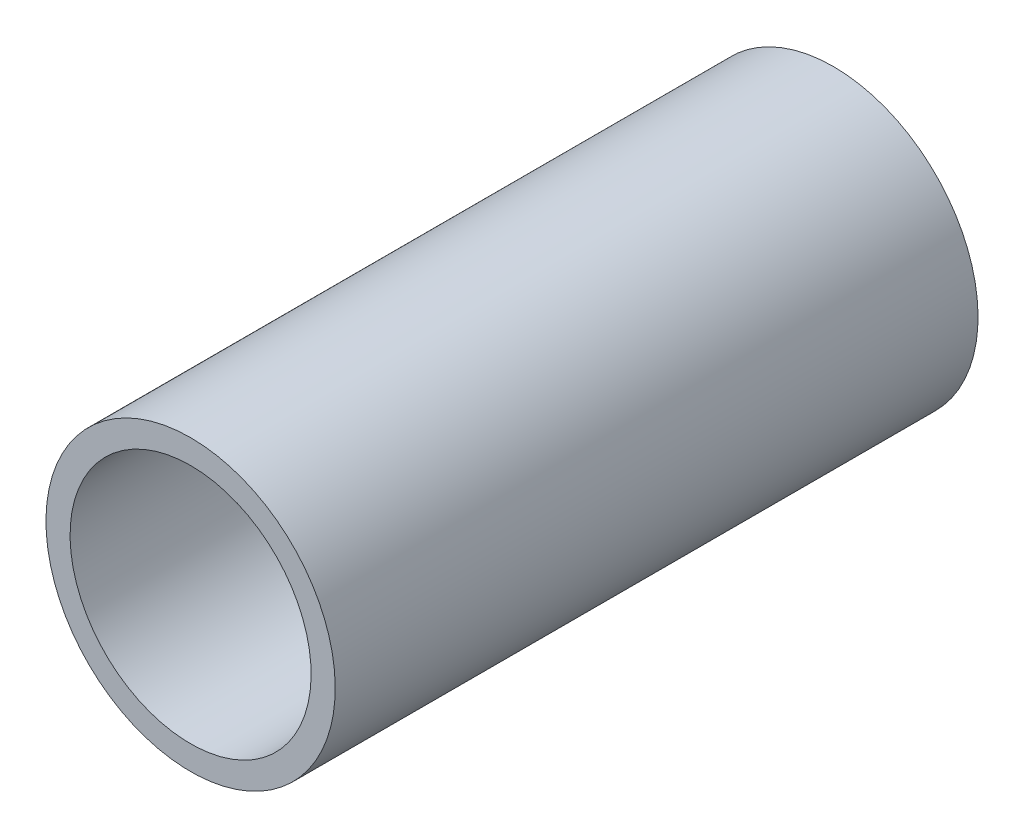
ISO-10303-21;
HEADER;
FILE_DESCRIPTION(('STEP AP214'),'2;1');
FILE_NAME('part.step','',(''),(''),'','','');
FILE_SCHEMA(('AUTOMOTIVE_DESIGN { 1 0 10303 214 1 1 1 1 }'));
ENDSEC;
DATA;
#1=APPLICATION_CONTEXT('core data for automotive mechanical design processes');
#2=APPLICATION_PROTOCOL_DEFINITION('international standard','automotive_design',2000,#1);
#3=PRODUCT_CONTEXT('',#1,'mechanical');
#4=PRODUCT('Part','Part','',(#3));
#5=PRODUCT_RELATED_PRODUCT_CATEGORY('part','',(#4));
#6=PRODUCT_DEFINITION_FORMATION('','',#4);
#7=PRODUCT_DEFINITION_CONTEXT('part definition',#1,'design');
#8=PRODUCT_DEFINITION('design','',#6,#7);
#9=PRODUCT_DEFINITION_SHAPE('','',#8);
#10=(LENGTH_UNIT() NAMED_UNIT(*) SI_UNIT(.MILLI.,.METRE.));
#11=(NAMED_UNIT(*) PLANE_ANGLE_UNIT() SI_UNIT($,.RADIAN.));
#12=(NAMED_UNIT(*) SI_UNIT($,.STERADIAN.) SOLID_ANGLE_UNIT());
#13=UNCERTAINTY_MEASURE_WITH_UNIT(LENGTH_MEASURE(1.E-05),#10,'distance_accuracy_value','');
#14=(GEOMETRIC_REPRESENTATION_CONTEXT(3) GLOBAL_UNCERTAINTY_ASSIGNED_CONTEXT((#13)) GLOBAL_UNIT_ASSIGNED_CONTEXT((#10,
#11,#12)) REPRESENTATION_CONTEXT('',''));
#15=CARTESIAN_POINT('',(0.,0.,0.));
#16=DIRECTION('',(0.,0.,1.));
#17=DIRECTION('',(1.,0.,0.));
#18=AXIS2_PLACEMENT_3D('',#15,#16,#17);
#19=CARTESIAN_POINT('',(0.,0.,40.));
#20=DIRECTION('',(0.,0.,-1.));
#21=DIRECTION('',(0.,1.,0.));
#22=AXIS2_PLACEMENT_3D('',#19,#20,#21);
#23=CYLINDRICAL_SURFACE('',#22,7.5);
#24=CARTESIAN_POINT('',(0.,0.,40.));
#25=DIRECTION('',(0.,0.,-1.));
#26=DIRECTION('',(0.,1.,0.));
#27=AXIS2_PLACEMENT_3D('',#24,#25,#26);
#28=CIRCLE('',#27,7.5);
#29=CARTESIAN_POINT('',(0.,7.5,40.));
#30=VERTEX_POINT('',#29);
#31=EDGE_CURVE('E17',#30,#30,#28,.T.);
#32=ORIENTED_EDGE('',*,*,#31,.F.);
#33=EDGE_LOOP('',(#32));
#34=FACE_BOUND('',#33,.T.);
#35=CARTESIAN_POINT('',(0.,0.,0.));
#36=DIRECTION('',(0.,0.,-1.));
#37=DIRECTION('',(0.,1.,0.));
#38=AXIS2_PLACEMENT_3D('',#35,#36,#37);
#39=CIRCLE('',#38,7.5);
#40=CARTESIAN_POINT('',(0.,7.49999999999998,0.));
#41=VERTEX_POINT('',#40);
#42=EDGE_CURVE('E26',#41,#41,#39,.T.);
#43=ORIENTED_EDGE('',*,*,#42,.T.);
#44=EDGE_LOOP('',(#43));
#45=FACE_BOUND('',#44,.T.);
#46=ADVANCED_FACE('F14',(#34,#45),#23,.F.);
#47=CARTESIAN_POINT('',(-9.108,-9.108,40.));
#48=DIRECTION('',(0.,0.,1.));
#49=DIRECTION('',(1.,0.,0.));
#50=AXIS2_PLACEMENT_3D('',#47,#48,#49);
#51=PLANE('',#50);
#52=CARTESIAN_POINT('',(0.,0.,40.));
#53=DIRECTION('',(0.,0.,-1.));
#54=DIRECTION('',(0.,1.,0.));
#55=AXIS2_PLACEMENT_3D('',#52,#53,#54);
#56=CIRCLE('',#55,9.);
#57=CARTESIAN_POINT('',(0.,9.,40.));
#58=VERTEX_POINT('',#57);
#59=EDGE_CURVE('E21',#58,#58,#56,.T.);
#60=ORIENTED_EDGE('',*,*,#59,.F.);
#61=EDGE_LOOP('',(#60));
#62=FACE_BOUND('',#61,.T.);
#63=ORIENTED_EDGE('',*,*,#31,.T.);
#64=EDGE_LOOP('',(#63));
#65=FACE_BOUND('',#64,.T.);
#66=ADVANCED_FACE('F34',(#62,#65),#51,.T.);
#67=CARTESIAN_POINT('',(-9.108,-9.108,0.));
#68=DIRECTION('',(0.,0.,1.));
#69=DIRECTION('',(1.,0.,0.));
#70=AXIS2_PLACEMENT_3D('',#67,#68,#69);
#71=PLANE('',#70);
#72=CARTESIAN_POINT('',(0.,0.,0.));
#73=DIRECTION('',(0.,0.,-1.));
#74=DIRECTION('',(0.,1.,0.));
#75=AXIS2_PLACEMENT_3D('',#72,#73,#74);
#76=CIRCLE('',#75,9.);
#77=CARTESIAN_POINT('',(0.,8.99999999999999,0.));
#78=VERTEX_POINT('',#77);
#79=EDGE_CURVE('E9',#78,#78,#76,.F.);
#80=ORIENTED_EDGE('',*,*,#79,.F.);
#81=EDGE_LOOP('',(#80));
#82=FACE_BOUND('',#81,.T.);
#83=ORIENTED_EDGE('',*,*,#42,.F.);
#84=EDGE_LOOP('',(#83));
#85=FACE_BOUND('',#84,.T.);
#86=ADVANCED_FACE('F41',(#82,#85),#71,.F.);
#87=CARTESIAN_POINT('',(0.,0.,40.));
#88=DIRECTION('',(0.,0.,-1.));
#89=DIRECTION('',(0.,1.,0.));
#90=AXIS2_PLACEMENT_3D('',#87,#88,#89);
#91=CYLINDRICAL_SURFACE('',#90,9.);
#92=ORIENTED_EDGE('',*,*,#59,.T.);
#93=EDGE_LOOP('',(#92));
#94=FACE_BOUND('',#93,.T.);
#95=ORIENTED_EDGE('',*,*,#79,.T.);
#96=EDGE_LOOP('',(#95));
#97=FACE_BOUND('',#96,.T.);
#98=ADVANCED_FACE('F43',(#94,#97),#91,.T.);
#99=CLOSED_SHELL('',(#46,#66,#86,#98));
#100=MANIFOLD_SOLID_BREP('B1',#99);
#101=ADVANCED_BREP_SHAPE_REPRESENTATION('',(#18,#100),#14);
#102=SHAPE_DEFINITION_REPRESENTATION(#9,#101);
ENDSEC;
END-ISO-10303-21;
